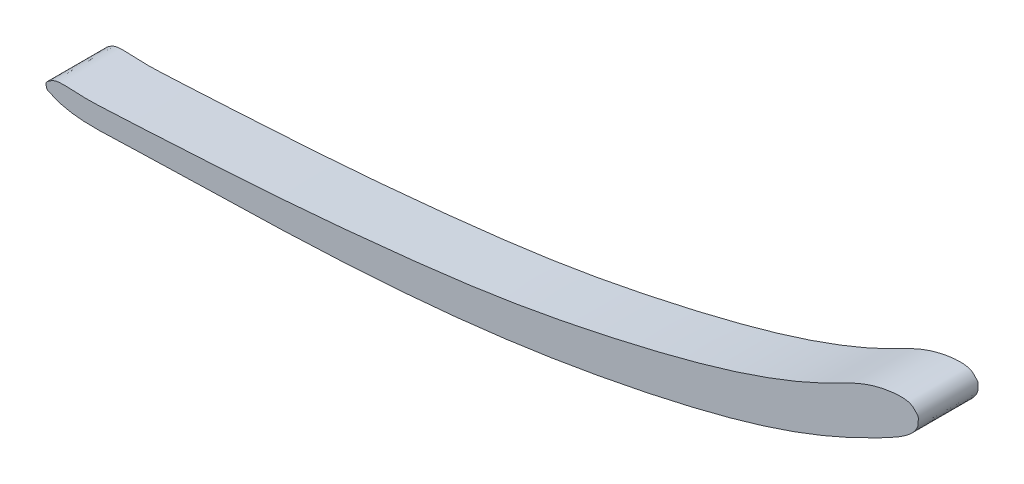
ISO-10303-21;
HEADER;
FILE_DESCRIPTION(('STEP AP214'),'2;1');
FILE_NAME('part.step','',(''),(''),'','','');
FILE_SCHEMA(('AUTOMOTIVE_DESIGN { 1 0 10303 214 1 1 1 1 }'));
ENDSEC;
DATA;
#1=APPLICATION_CONTEXT('core data for automotive mechanical design processes');
#2=APPLICATION_PROTOCOL_DEFINITION('international standard','automotive_design',2000,#1);
#3=PRODUCT_CONTEXT('',#1,'mechanical');
#4=PRODUCT('Part','Part','',(#3));
#5=PRODUCT_RELATED_PRODUCT_CATEGORY('part','',(#4));
#6=PRODUCT_DEFINITION_FORMATION('','',#4);
#7=PRODUCT_DEFINITION_CONTEXT('part definition',#1,'design');
#8=PRODUCT_DEFINITION('design','',#6,#7);
#9=PRODUCT_DEFINITION_SHAPE('','',#8);
#10=(LENGTH_UNIT() NAMED_UNIT(*) SI_UNIT(.MILLI.,.METRE.));
#11=(NAMED_UNIT(*) PLANE_ANGLE_UNIT() SI_UNIT($,.RADIAN.));
#12=(NAMED_UNIT(*) SI_UNIT($,.STERADIAN.) SOLID_ANGLE_UNIT());
#13=UNCERTAINTY_MEASURE_WITH_UNIT(LENGTH_MEASURE(1.E-05),#10,'distance_accuracy_value','');
#14=(GEOMETRIC_REPRESENTATION_CONTEXT(3) GLOBAL_UNCERTAINTY_ASSIGNED_CONTEXT((#13)) GLOBAL_UNIT_ASSIGNED_CONTEXT((#10,
#11,#12)) REPRESENTATION_CONTEXT('',''));
#15=CARTESIAN_POINT('',(0.,0.,0.));
#16=DIRECTION('',(0.,0.,1.));
#17=DIRECTION('',(1.,0.,0.));
#18=AXIS2_PLACEMENT_3D('',#15,#16,#17);
#19=CARTESIAN_POINT('',(61.9144333232568,0.,404.));
#20=CARTESIAN_POINT('',(61.8910860528611,0.0782803069081239,404.));
#21=CARTESIAN_POINT('',(61.8408245143477,0.142426428314579,404.));
#22=CARTESIAN_POINT('',(61.7354731441166,0.26430650552503,404.));
#23=CARTESIAN_POINT('',(61.6792254235422,0.321933614211289,404.));
#24=CARTESIAN_POINT('',(61.5141432967044,0.498210413844152,404.));
#25=CARTESIAN_POINT('',(61.4044094119887,0.617448967435513,404.));
#26=CARTESIAN_POINT('',(61.2223765037881,0.773551720380655,404.));
#27=CARTESIAN_POINT('',(61.1592082730367,0.822067081242661,404.));
#28=CARTESIAN_POINT('',(61.0241203339543,0.906733090161316,404.));
#29=CARTESIAN_POINT('',(60.952079215326,0.943441973781683,404.));
#30=CARTESIAN_POINT('',(60.7278566002738,1.0373110395038,404.));
#31=CARTESIAN_POINT('',(60.5728461930414,1.07679469058389,404.));
#32=CARTESIAN_POINT('',(60.2575105027948,1.13355935605872,404.));
#33=CARTESIAN_POINT('',(60.0964867874269,1.15015699680748,404.));
#34=CARTESIAN_POINT('',(59.7768234667799,1.17106697425273,404.));
#35=CARTESIAN_POINT('',(59.6174004859162,1.17499202301455,404.));
#36=CARTESIAN_POINT('',(59.1402080942976,1.16956588098227,404.));
#37=CARTESIAN_POINT('',(58.8234153505883,1.14460936181396,404.));
#38=CARTESIAN_POINT('',(57.8749129018753,1.03976827954361,404.));
#39=CARTESIAN_POINT('',(57.2432232594518,0.923753414046019,404.));
#40=CARTESIAN_POINT('',(56.0119590497997,0.6252114648298,404.));
#41=CARTESIAN_POINT('',(55.4096132540023,0.439743914805557,404.));
#42=CARTESIAN_POINT('',(53.6398182131852,-0.21811997657889,404.));
#43=CARTESIAN_POINT('',(52.5060924504743,-0.782728778117275,404.));
#44=CARTESIAN_POINT('',(50.8106571856886,-1.64256789716019,404.));
#45=CARTESIAN_POINT('',(50.245892022095,-1.93009433513777,404.));
#46=CARTESIAN_POINT('',(49.1107959664962,-2.49176632989498,404.));
#47=CARTESIAN_POINT('',(48.540878607665,-2.76690608507307,404.));
#48=CARTESIAN_POINT('',(46.8186513648411,-3.5623331004927,404.));
#49=CARTESIAN_POINT('',(45.6545778597723,-4.05433877664779,404.));
#50=CARTESIAN_POINT('',(43.3049128314598,-4.98661744932979,404.));
#51=CARTESIAN_POINT('',(42.1194629161964,-5.42723089357944,404.));
#52=CARTESIAN_POINT('',(39.7333118869133,-6.2717915160318,404.));
#53=CARTESIAN_POINT('',(38.5312212914228,-6.67432728752171,404.));
#54=CARTESIAN_POINT('',(36.1146868677063,-7.43791922463799,404.));
#55=CARTESIAN_POINT('',(34.9005206209736,-7.79988934834153,404.));
#56=CARTESIAN_POINT('',(31.2447559669853,-8.84121480780786,404.));
#57=CARTESIAN_POINT('',(28.7908168943178,-9.47699811994715,404.));
#58=CARTESIAN_POINT('',(23.8678814910705,-10.6762746103248,404.));
#59=CARTESIAN_POINT('',(21.3973067111557,-11.2376727910007,404.));
#60=CARTESIAN_POINT('',(16.4410137405621,-12.2968828971296,404.));
#61=CARTESIAN_POINT('',(13.9560203158382,-12.7949808662417,404.));
#62=CARTESIAN_POINT('',(8.96970380348965,-13.7045791162797,404.));
#63=CARTESIAN_POINT('',(6.46929570022869,-14.113864560495,404.));
#64=CARTESIAN_POINT('',(1.45584706059178,-14.8424528592261,404.));
#65=CARTESIAN_POINT('',(-1.05727965600683,-15.1638823977906,404.));
#66=CARTESIAN_POINT('',(-6.0907860040099,-15.7537126800032,404.));
#67=CARTESIAN_POINT('',(-8.61007146475508,-16.0240026915328,404.));
#68=CARTESIAN_POINT('',(-13.6519017686511,-16.5328869699139,404.));
#69=CARTESIAN_POINT('',(-16.1748387861037,-16.7691559296884,404.));
#70=CARTESIAN_POINT('',(-21.2240356467103,-17.2022823320139,404.));
#71=CARTESIAN_POINT('',(-23.750321005471,-17.3959429412104,404.));
#72=CARTESIAN_POINT('',(-28.8056607229678,-17.7456708186929,404.));
#73=CARTESIAN_POINT('',(-31.3347329163261,-17.9021657242696,404.));
#74=CARTESIAN_POINT('',(-36.3939841237608,-18.1960801375099,404.));
#75=CARTESIAN_POINT('',(-38.9239743524538,-18.3367879212014,404.));
#76=CARTESIAN_POINT('',(-42.7192454385247,-18.5424412358082,404.));
#77=CARTESIAN_POINT('',(-43.9844322281485,-18.609180636949,404.));
#78=CARTESIAN_POINT('',(-45.8825792202369,-18.7020853485504,404.));
#79=CARTESIAN_POINT('',(-46.5152644099059,-18.7339548529972,404.));
#80=CARTESIAN_POINT('',(-47.7808926174602,-18.7907697331514,404.));
#81=CARTESIAN_POINT('',(-48.4138288777348,-18.8159335272698,404.));
#82=CARTESIAN_POINT('',(-49.681050142534,-18.8304476391324,404.));
#83=CARTESIAN_POINT('',(-50.3145483583281,-18.8207531515915,404.));
#84=CARTESIAN_POINT('',(-51.5798816969746,-18.7557130850079,404.));
#85=CARTESIAN_POINT('',(-52.2133032088857,-18.69612581659,404.));
#86=CARTESIAN_POINT('',(-53.1625248065586,-18.7406766642071,404.));
#87=CARTESIAN_POINT('',(-53.4752290704572,-18.7781903810338,404.));
#88=CARTESIAN_POINT('',(-54.0785062857688,-18.9886702334022,404.));
#89=CARTESIAN_POINT('',(-54.3416471032879,-19.1636526552211,404.));
#90=CARTESIAN_POINT('',(-54.6582719989322,-19.3990568783967,404.));
#91=CARTESIAN_POINT('',(-54.7243616076951,-19.4444008530023,404.));
#92=CARTESIAN_POINT('',(-54.8320822546143,-19.5590772638887,404.));
#93=CARTESIAN_POINT('',(-54.868775297821,-19.632002493317,404.));
#94=CARTESIAN_POINT('',(-54.9003104213402,-19.7878467954328,404.));
#95=CARTESIAN_POINT('',(-54.8932597130813,-19.8674460640604,404.));
#96=CARTESIAN_POINT('',(-54.8702928024479,-20.0240472261276,404.));
#97=CARTESIAN_POINT('',(-54.8576483700863,-20.1020907287608,404.));
#98=CARTESIAN_POINT('',(-54.8129159680239,-20.2538722970682,404.));
#99=CARTESIAN_POINT('',(-54.7795147024771,-20.3285136807117,404.));
#100=CARTESIAN_POINT('',(-54.668260885,-20.4435592043035,404.));
#101=CARTESIAN_POINT('',(-54.5956987768541,-20.4788500401971,404.));
#102=CARTESIAN_POINT('',(-54.4484626961795,-20.5389778943337,404.));
#103=CARTESIAN_POINT('',(-54.3732563220533,-20.5652147871046,404.));
#104=CARTESIAN_POINT('',(-54.2257800390267,-20.6247638821378,404.));
#105=CARTESIAN_POINT('',(-54.152776918156,-20.6563094359935,404.));
#106=CARTESIAN_POINT('',(-53.9345565557629,-20.7528471657863,404.));
#107=CARTESIAN_POINT('',(-53.7901838400311,-20.8205523662182,404.));
#108=CARTESIAN_POINT('',(-53.4984217240588,-20.9463421871895,404.));
#109=CARTESIAN_POINT('',(-53.3506598366342,-21.0030716954071,404.));
#110=CARTESIAN_POINT('',(-52.9015289244283,-21.1540993560008,404.));
#111=CARTESIAN_POINT('',(-52.5952106177205,-21.2321736480998,404.));
#112=CARTESIAN_POINT('',(-51.9756954694793,-21.3657742365322,404.));
#113=CARTESIAN_POINT('',(-51.6617117145111,-21.4217538309383,404.));
#114=CARTESIAN_POINT('',(-51.0345611657516,-21.5128219054427,404.));
#115=CARTESIAN_POINT('',(-50.7208441598511,-21.5479752676143,404.));
#116=CARTESIAN_POINT('',(-49.7793324304827,-21.6270161737403,404.));
#117=CARTESIAN_POINT('',(-49.1511850565711,-21.6450749560085,404.));
#118=CARTESIAN_POINT('',(-47.8944971006351,-21.6523932411926,404.));
#119=CARTESIAN_POINT('',(-47.2659530283596,-21.6413971117434,404.));
#120=CARTESIAN_POINT('',(-45.3800645974265,-21.5896431349438,404.));
#121=CARTESIAN_POINT('',(-44.1225657541569,-21.5348316590438,404.));
#122=CARTESIAN_POINT('',(-41.6075770486901,-21.4385390885189,404.));
#123=CARTESIAN_POINT('',(-40.3499422388915,-21.3948704513751,404.));
#124=CARTESIAN_POINT('',(-36.5764686011246,-21.282010403883,404.));
#125=CARTESIAN_POINT('',(-34.0601905294723,-21.2268892585952,404.));
#126=CARTESIAN_POINT('',(-29.0279326893119,-21.1071989403538,404.));
#127=CARTESIAN_POINT('',(-26.5119344132417,-21.0429496903462,404.));
#128=CARTESIAN_POINT('',(-18.9656806214613,-20.7915105187116,404.));
#129=CARTESIAN_POINT('',(-13.9370884578859,-20.5476122800582,404.));
#130=CARTESIAN_POINT('',(-3.89806473402853,-19.8149682962137,404.));
#131=CARTESIAN_POINT('',(1.11457116242247,-19.3302947349707,404.));
#132=CARTESIAN_POINT('',(11.0964566662257,-18.0469418691553,404.));
#133=CARTESIAN_POINT('',(16.0695129384707,-17.2476191211638,404.));
#134=CARTESIAN_POINT('',(23.4874916215641,-15.8328293917239,404.));
#135=CARTESIAN_POINT('',(25.9518194938463,-15.3244007700768,404.));
#136=CARTESIAN_POINT('',(30.8628924621874,-14.2298150340925,404.));
#137=CARTESIAN_POINT('',(33.3094788452577,-13.642956294413,404.));
#138=CARTESIAN_POINT('',(38.1759464769594,-12.3511829505723,404.));
#139=CARTESIAN_POINT('',(40.5932480558674,-11.6475432563135,404.));
#140=CARTESIAN_POINT('',(45.3709187585321,-10.0635535614529,404.));
#141=CARTESIAN_POINT('',(47.7320429809903,-9.1822120566129,404.));
#142=CARTESIAN_POINT('',(52.3678797598866,-7.21627277280312,404.));
#143=CARTESIAN_POINT('',(54.6436633090672,-6.13250273778101,404.));
#144=CARTESIAN_POINT('',(57.4383790215061,-4.68342453085333,404.));
#145=CARTESIAN_POINT('',(57.9950546544809,-4.38884328687261,404.));
#146=CARTESIAN_POINT('',(58.8194171979385,-3.92829905988978,404.));
#147=CARTESIAN_POINT('',(59.0921102438671,-3.77107338908922,404.));
#148=CARTESIAN_POINT('',(59.6301895783498,-3.44367611240079,404.));
#149=CARTESIAN_POINT('',(59.8954522246401,-3.27448268456759,404.));
#150=CARTESIAN_POINT('',(60.4081515062827,-2.91293583518504,404.));
#151=CARTESIAN_POINT('',(60.6557559428328,-2.72057504134926,404.));
#152=CARTESIAN_POINT('',(61.1205080223412,-2.29549829451148,404.));
#153=CARTESIAN_POINT('',(61.3362315174206,-2.0611224534513,404.));
#154=CARTESIAN_POINT('',(61.6097391054491,-1.67636039629623,404.));
#155=CARTESIAN_POINT('',(61.6939085722394,-1.5410268633532,404.));
#156=CARTESIAN_POINT('',(61.831607027581,-1.25586574193046,404.));
#157=CARTESIAN_POINT('',(61.8856434330099,-1.10717593495038,404.));
#158=CARTESIAN_POINT('',(61.9360786227436,-0.791499600027529,404.));
#159=CARTESIAN_POINT('',(61.9300123616911,-0.632750144288069,404.));
#160=CARTESIAN_POINT('',(61.9250487639768,-0.394746434973281,404.));
#161=CARTESIAN_POINT('',(61.926934267888,-0.315510936949259,404.));
#162=CARTESIAN_POINT('',(61.9320289098032,-0.157095336859342,404.));
#163=CARTESIAN_POINT('',(61.9377805936526,-0.0782803069081239,404.));
#164=CARTESIAN_POINT('',(61.9144333232568,0.,404.));
#165=B_SPLINE_CURVE_WITH_KNOTS('',3,(#19,#20,#21,#22,#23,#24,#25,#26,#27,#28,#29,#30,#31,#32,
#33,#34,#35,#36,#37,#38,#39,#40,#41,#42,#43,#44,#45,#46,#47,#48,#49,#50,#51,#52,#53,#54,#55,#56,
#57,#58,#59,#60,#61,#62,#63,#64,#65,#66,#67,#68,#69,#70,#71,#72,#73,#74,#75,#76,#77,#78,#79,#80,
#81,#82,#83,#84,#85,#86,#87,#88,#89,#90,#91,#92,#93,#94,#95,#96,#97,#98,#99,#100,#101,#102,#103,
#104,#105,#106,#107,#108,#109,#110,#111,#112,#113,#114,#115,#116,#117,#118,#119,#120,#121,#122,
#123,#124,#125,#126,#127,#128,#129,#130,#131,#132,#133,#134,#135,#136,#137,#138,#139,#140,#141,
#142,#143,#144,#145,#146,#147,#148,#149,#150,#151,#152,#153,#154,#155,#156,#157,#158,#159,#160,
#161,#162,#163,#164),.UNSPECIFIED.,.T.,.F.,(4,2,2,2,2,2,2,2,2,2,2,2,2,2,2,2,2,2,2,2,2,2,2,2,2,2,
2,2,2,2,2,2,2,2,2,2,2,2,2,2,2,2,2,2,2,2,2,2,2,2,2,2,2,2,2,2,2,2,2,2,2,2,2,2,2,2,2,2,2,2,2,2,4),
(0.,0.00097656250000005,0.0019531250000001,0.00390625000000014,0.00488281250000016,
0.00585937500000019,0.00781250000000023,0.00976562500000027,0.0117187500000003,
0.0156250000000003,0.0234375000000003,0.0312500000000003,0.0468750000000003,0.0546875000000003,
0.0625000000000003,0.0781250000000003,0.0937500000000002,0.109375,0.125,0.15625,0.1875,0.21875,
0.25,0.28125,0.3125,0.34375,0.375,0.40625,0.4375,0.453125,0.4609375,0.46875,0.4765625,0.484375,
0.48828125,0.4921875,0.4931640625,0.494140625,0.4951171875,0.49609375,0.4970703125,0.498046875,
0.4990234375,0.5,0.501953125,0.50390625,0.5078125,0.51171875,0.515625,0.5234375,0.53125,
0.546875,0.5625,0.59375,0.625,0.6875,0.75,0.8125,0.84375,0.875,0.90625,0.9375,0.96875,0.9765625,
0.98046875,0.984375,0.98828125,0.9921875,0.994140625,0.99609375,0.998046875,0.9990234375,1.),.UNSPECIFIED.);
#166=DIRECTION('',(0.,0.,-1.));
#167=VECTOR('',#166,1.);
#168=SURFACE_OF_LINEAR_EXTRUSION('',#165,#167);
#169=CARTESIAN_POINT('',(61.9144333232568,0.,404.));
#170=CARTESIAN_POINT('',(61.9377805936526,-0.0782803069081239,404.));
#171=CARTESIAN_POINT('',(61.9320289098032,-0.157095336859342,404.));
#172=CARTESIAN_POINT('',(61.926934267888,-0.315510936949259,404.));
#173=CARTESIAN_POINT('',(61.9250487639768,-0.394746434973281,404.));
#174=CARTESIAN_POINT('',(61.9300123616911,-0.632750144288069,404.));
#175=CARTESIAN_POINT('',(61.9360786227436,-0.791499600027529,404.));
#176=CARTESIAN_POINT('',(61.8856434330099,-1.10717593495038,404.));
#177=CARTESIAN_POINT('',(61.831607027581,-1.25586574193046,404.));
#178=CARTESIAN_POINT('',(61.6939085722394,-1.5410268633532,404.));
#179=CARTESIAN_POINT('',(61.6097391054491,-1.67636039629623,404.));
#180=CARTESIAN_POINT('',(61.3362315174206,-2.0611224534513,404.));
#181=CARTESIAN_POINT('',(61.1205080223412,-2.29549829451148,404.));
#182=CARTESIAN_POINT('',(60.6557559428328,-2.72057504134926,404.));
#183=CARTESIAN_POINT('',(60.4081515062827,-2.91293583518504,404.));
#184=CARTESIAN_POINT('',(59.8954522246401,-3.27448268456759,404.));
#185=CARTESIAN_POINT('',(59.6301895783498,-3.44367611240079,404.));
#186=CARTESIAN_POINT('',(59.0921102438671,-3.77107338908922,404.));
#187=CARTESIAN_POINT('',(58.8194171979385,-3.92829905988978,404.));
#188=CARTESIAN_POINT('',(57.9950546544809,-4.38884328687261,404.));
#189=CARTESIAN_POINT('',(57.4383790215061,-4.68342453085333,404.));
#190=CARTESIAN_POINT('',(54.6436633090672,-6.13250273778101,404.));
#191=CARTESIAN_POINT('',(52.3678797598866,-7.21627277280312,404.));
#192=CARTESIAN_POINT('',(47.7320429809903,-9.1822120566129,404.));
#193=CARTESIAN_POINT('',(45.3709187585321,-10.0635535614529,404.));
#194=CARTESIAN_POINT('',(40.5932480558674,-11.6475432563135,404.));
#195=CARTESIAN_POINT('',(38.1759464769594,-12.3511829505723,404.));
#196=CARTESIAN_POINT('',(33.3094788452577,-13.642956294413,404.));
#197=CARTESIAN_POINT('',(30.8628924621874,-14.2298150340925,404.));
#198=CARTESIAN_POINT('',(25.9518194938463,-15.3244007700768,404.));
#199=CARTESIAN_POINT('',(23.4874916215641,-15.8328293917239,404.));
#200=CARTESIAN_POINT('',(16.0695129384707,-17.2476191211638,404.));
#201=CARTESIAN_POINT('',(11.0964566662257,-18.0469418691553,404.));
#202=CARTESIAN_POINT('',(1.11457116242247,-19.3302947349707,404.));
#203=CARTESIAN_POINT('',(-3.89806473402853,-19.8149682962137,404.));
#204=CARTESIAN_POINT('',(-13.9370884578859,-20.5476122800582,404.));
#205=CARTESIAN_POINT('',(-18.9656806214613,-20.7915105187116,404.));
#206=CARTESIAN_POINT('',(-26.5119344132417,-21.0429496903462,404.));
#207=CARTESIAN_POINT('',(-29.0279326893119,-21.1071989403538,404.));
#208=CARTESIAN_POINT('',(-34.0601905294723,-21.2268892585952,404.));
#209=CARTESIAN_POINT('',(-36.5764686011246,-21.282010403883,404.));
#210=CARTESIAN_POINT('',(-40.3499422388915,-21.3948704513751,404.));
#211=CARTESIAN_POINT('',(-41.6075770486901,-21.4385390885189,404.));
#212=CARTESIAN_POINT('',(-44.1225657541569,-21.5348316590438,404.));
#213=CARTESIAN_POINT('',(-45.3800645974265,-21.5896431349438,404.));
#214=CARTESIAN_POINT('',(-47.2659530283596,-21.6413971117434,404.));
#215=CARTESIAN_POINT('',(-47.8944971006351,-21.6523932411926,404.));
#216=CARTESIAN_POINT('',(-49.1511850565711,-21.6450749560085,404.));
#217=CARTESIAN_POINT('',(-49.7793324304827,-21.6270161737403,404.));
#218=CARTESIAN_POINT('',(-50.7208441598511,-21.5479752676143,404.));
#219=CARTESIAN_POINT('',(-51.0345611657516,-21.5128219054427,404.));
#220=CARTESIAN_POINT('',(-51.6617117145111,-21.4217538309383,404.));
#221=CARTESIAN_POINT('',(-51.9756954694793,-21.3657742365322,404.));
#222=CARTESIAN_POINT('',(-52.5952106177205,-21.2321736480998,404.));
#223=CARTESIAN_POINT('',(-52.9015289244283,-21.1540993560008,404.));
#224=CARTESIAN_POINT('',(-53.3506598366342,-21.0030716954071,404.));
#225=CARTESIAN_POINT('',(-53.4984217240588,-20.9463421871895,404.));
#226=CARTESIAN_POINT('',(-53.7901838400311,-20.8205523662182,404.));
#227=CARTESIAN_POINT('',(-53.9345565557629,-20.7528471657863,404.));
#228=CARTESIAN_POINT('',(-54.152776918156,-20.6563094359935,404.));
#229=CARTESIAN_POINT('',(-54.2257800390267,-20.6247638821378,404.));
#230=CARTESIAN_POINT('',(-54.3732563220533,-20.5652147871046,404.));
#231=CARTESIAN_POINT('',(-54.4484626961795,-20.5389778943337,404.));
#232=CARTESIAN_POINT('',(-54.5956987768541,-20.4788500401971,404.));
#233=CARTESIAN_POINT('',(-54.668260885,-20.4435592043035,404.));
#234=CARTESIAN_POINT('',(-54.7795147024771,-20.3285136807117,404.));
#235=CARTESIAN_POINT('',(-54.8129159680239,-20.2538722970682,404.));
#236=CARTESIAN_POINT('',(-54.8576483700863,-20.1020907287608,404.));
#237=CARTESIAN_POINT('',(-54.8702928024479,-20.0240472261276,404.));
#238=CARTESIAN_POINT('',(-54.8932597130813,-19.8674460640604,404.));
#239=CARTESIAN_POINT('',(-54.9003104213402,-19.7878467954328,404.));
#240=CARTESIAN_POINT('',(-54.868775297821,-19.632002493317,404.));
#241=CARTESIAN_POINT('',(-54.8320822546143,-19.5590772638887,404.));
#242=CARTESIAN_POINT('',(-54.7243616076951,-19.4444008530023,404.));
#243=CARTESIAN_POINT('',(-54.6582719989322,-19.3990568783967,404.));
#244=CARTESIAN_POINT('',(-54.3416471032879,-19.1636526552211,404.));
#245=CARTESIAN_POINT('',(-54.0785062857688,-18.9886702334022,404.));
#246=CARTESIAN_POINT('',(-53.4752290704572,-18.7781903810338,404.));
#247=CARTESIAN_POINT('',(-53.1625248065586,-18.7406766642071,404.));
#248=CARTESIAN_POINT('',(-52.2133032088857,-18.69612581659,404.));
#249=CARTESIAN_POINT('',(-51.5798816969746,-18.7557130850079,404.));
#250=CARTESIAN_POINT('',(-50.3145483583281,-18.8207531515915,404.));
#251=CARTESIAN_POINT('',(-49.681050142534,-18.8304476391324,404.));
#252=CARTESIAN_POINT('',(-48.4138288777348,-18.8159335272698,404.));
#253=CARTESIAN_POINT('',(-47.7808926174602,-18.7907697331514,404.));
#254=CARTESIAN_POINT('',(-46.5152644099059,-18.7339548529972,404.));
#255=CARTESIAN_POINT('',(-45.8825792202369,-18.7020853485504,404.));
#256=CARTESIAN_POINT('',(-43.9844322281485,-18.609180636949,404.));
#257=CARTESIAN_POINT('',(-42.7192454385247,-18.5424412358082,404.));
#258=CARTESIAN_POINT('',(-38.9239743524538,-18.3367879212014,404.));
#259=CARTESIAN_POINT('',(-36.3939841237608,-18.1960801375099,404.));
#260=CARTESIAN_POINT('',(-31.3347329163261,-17.9021657242696,404.));
#261=CARTESIAN_POINT('',(-28.8056607229678,-17.7456708186929,404.));
#262=CARTESIAN_POINT('',(-23.750321005471,-17.3959429412104,404.));
#263=CARTESIAN_POINT('',(-21.2240356467103,-17.2022823320139,404.));
#264=CARTESIAN_POINT('',(-16.1748387861037,-16.7691559296884,404.));
#265=CARTESIAN_POINT('',(-13.6519017686511,-16.5328869699139,404.));
#266=CARTESIAN_POINT('',(-8.61007146475508,-16.0240026915328,404.));
#267=CARTESIAN_POINT('',(-6.0907860040099,-15.7537126800032,404.));
#268=CARTESIAN_POINT('',(-1.05727965600683,-15.1638823977906,404.));
#269=CARTESIAN_POINT('',(1.45584706059178,-14.8424528592261,404.));
#270=CARTESIAN_POINT('',(6.46929570022869,-14.113864560495,404.));
#271=CARTESIAN_POINT('',(8.96970380348965,-13.7045791162797,404.));
#272=CARTESIAN_POINT('',(13.9560203158382,-12.7949808662417,404.));
#273=CARTESIAN_POINT('',(16.4410137405621,-12.2968828971296,404.));
#274=CARTESIAN_POINT('',(21.3973067111557,-11.2376727910007,404.));
#275=CARTESIAN_POINT('',(23.8678814910705,-10.6762746103248,404.));
#276=CARTESIAN_POINT('',(28.7908168943178,-9.47699811994715,404.));
#277=CARTESIAN_POINT('',(31.2447559669853,-8.84121480780786,404.));
#278=CARTESIAN_POINT('',(34.9005206209736,-7.79988934834153,404.));
#279=CARTESIAN_POINT('',(36.1146868677063,-7.43791922463799,404.));
#280=CARTESIAN_POINT('',(38.5312212914228,-6.67432728752171,404.));
#281=CARTESIAN_POINT('',(39.7333118869133,-6.2717915160318,404.));
#282=CARTESIAN_POINT('',(42.1194629161964,-5.42723089357944,404.));
#283=CARTESIAN_POINT('',(43.3049128314598,-4.98661744932979,404.));
#284=CARTESIAN_POINT('',(45.6545778597723,-4.05433877664779,404.));
#285=CARTESIAN_POINT('',(46.8186513648411,-3.5623331004927,404.));
#286=CARTESIAN_POINT('',(48.540878607665,-2.76690608507307,404.));
#287=CARTESIAN_POINT('',(49.1107959664962,-2.49176632989498,404.));
#288=CARTESIAN_POINT('',(50.245892022095,-1.93009433513777,404.));
#289=CARTESIAN_POINT('',(50.8106571856886,-1.64256789716019,404.));
#290=CARTESIAN_POINT('',(52.5060924504743,-0.782728778117275,404.));
#291=CARTESIAN_POINT('',(53.6398182131852,-0.21811997657889,404.));
#292=CARTESIAN_POINT('',(55.4096132540023,0.439743914805557,404.));
#293=CARTESIAN_POINT('',(56.0119590497997,0.6252114648298,404.));
#294=CARTESIAN_POINT('',(57.2432232594518,0.923753414046019,404.));
#295=CARTESIAN_POINT('',(57.8749129018753,1.03976827954361,404.));
#296=CARTESIAN_POINT('',(58.8234153505883,1.14460936181396,404.));
#297=CARTESIAN_POINT('',(59.1402080942976,1.16956588098227,404.));
#298=CARTESIAN_POINT('',(59.6174004859162,1.17499202301455,404.));
#299=CARTESIAN_POINT('',(59.7768234667799,1.17106697425273,404.));
#300=CARTESIAN_POINT('',(60.0964867874269,1.15015699680748,404.));
#301=CARTESIAN_POINT('',(60.2575105027948,1.13355935605872,404.));
#302=CARTESIAN_POINT('',(60.5728461930414,1.07679469058389,404.));
#303=CARTESIAN_POINT('',(60.7278566002738,1.0373110395038,404.));
#304=CARTESIAN_POINT('',(60.952079215326,0.943441973781683,404.));
#305=CARTESIAN_POINT('',(61.0241203339543,0.906733090161316,404.));
#306=CARTESIAN_POINT('',(61.1592082730367,0.822067081242661,404.));
#307=CARTESIAN_POINT('',(61.2223765037881,0.773551720380655,404.));
#308=CARTESIAN_POINT('',(61.4044094119887,0.617448967435513,404.));
#309=CARTESIAN_POINT('',(61.5141432967044,0.498210413844152,404.));
#310=CARTESIAN_POINT('',(61.6792254235422,0.321933614211289,404.));
#311=CARTESIAN_POINT('',(61.7354731441166,0.26430650552503,404.));
#312=CARTESIAN_POINT('',(61.8408245143477,0.142426428314579,404.));
#313=CARTESIAN_POINT('',(61.8910860528611,0.0782803069081239,404.));
#314=CARTESIAN_POINT('',(61.9144333232568,0.,404.));
#315=B_SPLINE_CURVE_WITH_KNOTS('',3,(#169,#170,#171,#172,#173,#174,#175,#176,#177,#178,#179,
#180,#181,#182,#183,#184,#185,#186,#187,#188,#189,#190,#191,#192,#193,#194,#195,#196,#197,#198,
#199,#200,#201,#202,#203,#204,#205,#206,#207,#208,#209,#210,#211,#212,#213,#214,#215,#216,#217,
#218,#219,#220,#221,#222,#223,#224,#225,#226,#227,#228,#229,#230,#231,#232,#233,#234,#235,#236,
#237,#238,#239,#240,#241,#242,#243,#244,#245,#246,#247,#248,#249,#250,#251,#252,#253,#254,#255,
#256,#257,#258,#259,#260,#261,#262,#263,#264,#265,#266,#267,#268,#269,#270,#271,#272,#273,#274,
#275,#276,#277,#278,#279,#280,#281,#282,#283,#284,#285,#286,#287,#288,#289,#290,#291,#292,#293,
#294,#295,#296,#297,#298,#299,#300,#301,#302,#303,#304,#305,#306,#307,#308,#309,#310,#311,#312,
#313,#314),.UNSPECIFIED.,.T.,.F.,(4,2,2,2,2,2,2,2,2,2,2,2,2,2,2,2,2,2,2,2,2,2,2,2,2,2,2,2,2,2,2,
2,2,2,2,2,2,2,2,2,2,2,2,2,2,2,2,2,2,2,2,2,2,2,2,2,2,2,2,2,2,2,2,2,2,2,2,2,2,2,2,2,4),(0.,
0.000976562499999889,0.001953125,0.00390625,0.005859375,0.0078125,0.0117187499999999,
0.0156249999999999,0.0195312499999999,0.0234374999999999,0.0312499999999999,0.0625,0.09375,
0.125,0.15625,0.1875,0.25,0.3125,0.375,0.40625,0.4375,0.453125,0.46875,0.4765625,0.484375,
0.48828125,0.4921875,0.49609375,0.498046875,0.5,0.5009765625,0.501953125,0.5029296875,
0.50390625,0.5048828125,0.505859375,0.5068359375,0.5078125,0.51171875,0.515625,0.5234375,
0.53125,0.5390625,0.546875,0.5625,0.59375,0.625,0.65625,0.6875,0.71875,0.75,0.78125,0.8125,
0.84375,0.875,0.890625,0.90625,0.921875,0.9375,0.9453125,0.953125,0.96875,0.9765625,0.984375,
0.98828125,0.990234375,0.9921875,0.994140625,0.9951171875,0.99609375,0.998046875,0.9990234375,
1.),.UNSPECIFIED.);
#316=CARTESIAN_POINT('',(61.9144333232568,0.,404.));
#317=VERTEX_POINT('',#316);
#318=EDGE_CURVE('E10',#317,#317,#315,.F.);
#319=ORIENTED_EDGE('',*,*,#318,.F.);
#320=EDGE_LOOP('',(#319));
#321=FACE_BOUND('',#320,.T.);
#322=CARTESIAN_POINT('',(61.9144333232568,0.,396.000000000001));
#323=CARTESIAN_POINT('',(61.8910860528611,0.0782803069081239,396.000000000001));
#324=CARTESIAN_POINT('',(61.8408245143477,0.142426428314579,396.000000000001));
#325=CARTESIAN_POINT('',(61.7354731441166,0.26430650552503,396.000000000001));
#326=CARTESIAN_POINT('',(61.6792254235422,0.321933614211289,396.000000000001));
#327=CARTESIAN_POINT('',(61.5141432967044,0.498210413844152,396.000000000001));
#328=CARTESIAN_POINT('',(61.4044094119887,0.617448967435513,396.000000000001));
#329=CARTESIAN_POINT('',(61.2223765037881,0.773551720380655,396.000000000001));
#330=CARTESIAN_POINT('',(61.1592082730367,0.822067081242661,396.000000000001));
#331=CARTESIAN_POINT('',(61.0241203339543,0.906733090161316,396.000000000001));
#332=CARTESIAN_POINT('',(60.952079215326,0.943441973781683,396.000000000001));
#333=CARTESIAN_POINT('',(60.7278566002738,1.0373110395038,396.000000000001));
#334=CARTESIAN_POINT('',(60.5728461930414,1.07679469058389,396.000000000001));
#335=CARTESIAN_POINT('',(60.2575105027948,1.13355935605872,396.000000000001));
#336=CARTESIAN_POINT('',(60.0964867874269,1.15015699680748,396.000000000001));
#337=CARTESIAN_POINT('',(59.7768234667799,1.17106697425273,396.000000000001));
#338=CARTESIAN_POINT('',(59.6174004859162,1.17499202301455,396.000000000001));
#339=CARTESIAN_POINT('',(59.1402080942976,1.16956588098227,396.000000000001));
#340=CARTESIAN_POINT('',(58.8234153505883,1.14460936181396,396.000000000001));
#341=CARTESIAN_POINT('',(57.8749129018753,1.03976827954361,396.000000000001));
#342=CARTESIAN_POINT('',(57.2432232594518,0.923753414046019,396.000000000001));
#343=CARTESIAN_POINT('',(56.0119590497997,0.6252114648298,396.000000000001));
#344=CARTESIAN_POINT('',(55.4096132540023,0.439743914805557,396.000000000001));
#345=CARTESIAN_POINT('',(53.6398182131852,-0.21811997657889,396.000000000001));
#346=CARTESIAN_POINT('',(52.5060924504743,-0.782728778117275,396.000000000001));
#347=CARTESIAN_POINT('',(50.8106571856886,-1.64256789716019,396.000000000001));
#348=CARTESIAN_POINT('',(50.245892022095,-1.93009433513777,396.000000000001));
#349=CARTESIAN_POINT('',(49.1107959664962,-2.49176632989498,396.000000000001));
#350=CARTESIAN_POINT('',(48.540878607665,-2.76690608507307,396.000000000001));
#351=CARTESIAN_POINT('',(46.8186513648411,-3.5623331004927,396.000000000001));
#352=CARTESIAN_POINT('',(45.6545778597723,-4.05433877664779,396.000000000001));
#353=CARTESIAN_POINT('',(43.3049128314598,-4.98661744932979,396.000000000001));
#354=CARTESIAN_POINT('',(42.1194629161964,-5.42723089357944,396.000000000001));
#355=CARTESIAN_POINT('',(39.7333118869133,-6.2717915160318,396.000000000001));
#356=CARTESIAN_POINT('',(38.5312212914228,-6.67432728752171,396.000000000001));
#357=CARTESIAN_POINT('',(36.1146868677063,-7.43791922463799,396.000000000001));
#358=CARTESIAN_POINT('',(34.9005206209736,-7.79988934834153,396.000000000001));
#359=CARTESIAN_POINT('',(31.2447559669853,-8.84121480780786,396.000000000001));
#360=CARTESIAN_POINT('',(28.7908168943178,-9.47699811994715,396.000000000001));
#361=CARTESIAN_POINT('',(23.8678814910705,-10.6762746103248,396.000000000001));
#362=CARTESIAN_POINT('',(21.3973067111557,-11.2376727910007,396.000000000001));
#363=CARTESIAN_POINT('',(16.4410137405621,-12.2968828971296,396.000000000001));
#364=CARTESIAN_POINT('',(13.9560203158382,-12.7949808662417,396.000000000001));
#365=CARTESIAN_POINT('',(8.96970380348965,-13.7045791162797,396.000000000001));
#366=CARTESIAN_POINT('',(6.46929570022869,-14.113864560495,396.000000000001));
#367=CARTESIAN_POINT('',(1.45584706059178,-14.8424528592261,396.000000000001));
#368=CARTESIAN_POINT('',(-1.05727965600683,-15.1638823977906,396.000000000001));
#369=CARTESIAN_POINT('',(-6.0907860040099,-15.7537126800032,396.000000000001));
#370=CARTESIAN_POINT('',(-8.61007146475508,-16.0240026915328,396.000000000001));
#371=CARTESIAN_POINT('',(-13.6519017686511,-16.5328869699139,396.000000000001));
#372=CARTESIAN_POINT('',(-16.1748387861037,-16.7691559296884,396.000000000001));
#373=CARTESIAN_POINT('',(-21.2240356467103,-17.2022823320139,396.000000000001));
#374=CARTESIAN_POINT('',(-23.750321005471,-17.3959429412104,396.000000000001));
#375=CARTESIAN_POINT('',(-28.8056607229678,-17.7456708186929,396.000000000001));
#376=CARTESIAN_POINT('',(-31.3347329163261,-17.9021657242696,396.000000000001));
#377=CARTESIAN_POINT('',(-36.3939841237608,-18.1960801375099,396.000000000001));
#378=CARTESIAN_POINT('',(-38.9239743524538,-18.3367879212014,396.000000000001));
#379=CARTESIAN_POINT('',(-42.7192454385247,-18.5424412358082,396.000000000001));
#380=CARTESIAN_POINT('',(-43.9844322281485,-18.609180636949,396.000000000001));
#381=CARTESIAN_POINT('',(-45.8825792202369,-18.7020853485504,396.000000000001));
#382=CARTESIAN_POINT('',(-46.5152644099059,-18.7339548529972,396.000000000001));
#383=CARTESIAN_POINT('',(-47.7808926174602,-18.7907697331514,396.000000000001));
#384=CARTESIAN_POINT('',(-48.4138288777348,-18.8159335272698,396.000000000001));
#385=CARTESIAN_POINT('',(-49.681050142534,-18.8304476391324,396.000000000001));
#386=CARTESIAN_POINT('',(-50.3145483583281,-18.8207531515915,396.000000000001));
#387=CARTESIAN_POINT('',(-51.5798816969746,-18.7557130850079,396.000000000001));
#388=CARTESIAN_POINT('',(-52.2133032088857,-18.69612581659,396.000000000001));
#389=CARTESIAN_POINT('',(-53.1625248065586,-18.7406766642071,396.000000000001));
#390=CARTESIAN_POINT('',(-53.4752290704572,-18.7781903810338,396.000000000001));
#391=CARTESIAN_POINT('',(-54.0785062857688,-18.9886702334022,396.000000000001));
#392=CARTESIAN_POINT('',(-54.3416471032879,-19.1636526552211,396.000000000001));
#393=CARTESIAN_POINT('',(-54.6582719989322,-19.3990568783967,396.000000000001));
#394=CARTESIAN_POINT('',(-54.7243616076951,-19.4444008530023,396.000000000001));
#395=CARTESIAN_POINT('',(-54.8320822546143,-19.5590772638887,396.000000000001));
#396=CARTESIAN_POINT('',(-54.868775297821,-19.632002493317,396.000000000001));
#397=CARTESIAN_POINT('',(-54.9003104213402,-19.7878467954328,396.000000000001));
#398=CARTESIAN_POINT('',(-54.8932597130813,-19.8674460640604,396.000000000001));
#399=CARTESIAN_POINT('',(-54.8702928024479,-20.0240472261276,396.000000000001));
#400=CARTESIAN_POINT('',(-54.8576483700863,-20.1020907287608,396.000000000001));
#401=CARTESIAN_POINT('',(-54.8129159680239,-20.2538722970682,396.000000000001));
#402=CARTESIAN_POINT('',(-54.7795147024771,-20.3285136807117,396.000000000001));
#403=CARTESIAN_POINT('',(-54.668260885,-20.4435592043035,396.000000000001));
#404=CARTESIAN_POINT('',(-54.5956987768541,-20.4788500401971,396.000000000001));
#405=CARTESIAN_POINT('',(-54.4484626961795,-20.5389778943337,396.000000000001));
#406=CARTESIAN_POINT('',(-54.3732563220533,-20.5652147871046,396.000000000001));
#407=CARTESIAN_POINT('',(-54.2257800390267,-20.6247638821378,396.000000000001));
#408=CARTESIAN_POINT('',(-54.152776918156,-20.6563094359935,396.000000000001));
#409=CARTESIAN_POINT('',(-53.9345565557629,-20.7528471657863,396.000000000001));
#410=CARTESIAN_POINT('',(-53.7901838400311,-20.8205523662182,396.000000000001));
#411=CARTESIAN_POINT('',(-53.4984217240588,-20.9463421871895,396.000000000001));
#412=CARTESIAN_POINT('',(-53.3506598366342,-21.0030716954071,396.000000000001));
#413=CARTESIAN_POINT('',(-52.9015289244283,-21.1540993560008,396.000000000001));
#414=CARTESIAN_POINT('',(-52.5952106177205,-21.2321736480998,396.000000000001));
#415=CARTESIAN_POINT('',(-51.9756954694793,-21.3657742365322,396.000000000001));
#416=CARTESIAN_POINT('',(-51.6617117145111,-21.4217538309383,396.000000000001));
#417=CARTESIAN_POINT('',(-51.0345611657516,-21.5128219054427,396.000000000001));
#418=CARTESIAN_POINT('',(-50.7208441598511,-21.5479752676143,396.000000000001));
#419=CARTESIAN_POINT('',(-49.7793324304827,-21.6270161737403,396.000000000001));
#420=CARTESIAN_POINT('',(-49.1511850565711,-21.6450749560085,396.000000000001));
#421=CARTESIAN_POINT('',(-47.8944971006351,-21.6523932411926,396.000000000001));
#422=CARTESIAN_POINT('',(-47.2659530283596,-21.6413971117434,396.000000000001));
#423=CARTESIAN_POINT('',(-45.3800645974265,-21.5896431349438,396.000000000001));
#424=CARTESIAN_POINT('',(-44.1225657541569,-21.5348316590438,396.000000000001));
#425=CARTESIAN_POINT('',(-41.6075770486901,-21.4385390885189,396.000000000001));
#426=CARTESIAN_POINT('',(-40.3499422388915,-21.3948704513751,396.000000000001));
#427=CARTESIAN_POINT('',(-36.5764686011246,-21.282010403883,396.000000000001));
#428=CARTESIAN_POINT('',(-34.0601905294723,-21.2268892585952,396.000000000001));
#429=CARTESIAN_POINT('',(-29.0279326893119,-21.1071989403538,396.000000000001));
#430=CARTESIAN_POINT('',(-26.5119344132417,-21.0429496903462,396.000000000001));
#431=CARTESIAN_POINT('',(-18.9656806214613,-20.7915105187116,396.000000000001));
#432=CARTESIAN_POINT('',(-13.9370884578859,-20.5476122800582,396.000000000001));
#433=CARTESIAN_POINT('',(-3.89806473402853,-19.8149682962137,396.000000000001));
#434=CARTESIAN_POINT('',(1.11457116242247,-19.3302947349707,396.000000000001));
#435=CARTESIAN_POINT('',(11.0964566662257,-18.0469418691553,396.000000000001));
#436=CARTESIAN_POINT('',(16.0695129384707,-17.2476191211638,396.000000000001));
#437=CARTESIAN_POINT('',(23.4874916215641,-15.8328293917239,396.000000000001));
#438=CARTESIAN_POINT('',(25.9518194938463,-15.3244007700768,396.000000000001));
#439=CARTESIAN_POINT('',(30.8628924621874,-14.2298150340925,396.000000000001));
#440=CARTESIAN_POINT('',(33.3094788452577,-13.642956294413,396.000000000001));
#441=CARTESIAN_POINT('',(38.1759464769594,-12.3511829505723,396.000000000001));
#442=CARTESIAN_POINT('',(40.5932480558674,-11.6475432563135,396.000000000001));
#443=CARTESIAN_POINT('',(45.3709187585321,-10.0635535614529,396.000000000001));
#444=CARTESIAN_POINT('',(47.7320429809903,-9.1822120566129,396.000000000001));
#445=CARTESIAN_POINT('',(52.3678797598866,-7.21627277280312,396.000000000001));
#446=CARTESIAN_POINT('',(54.6436633090672,-6.13250273778101,396.000000000001));
#447=CARTESIAN_POINT('',(57.4383790215061,-4.68342453085333,396.000000000001));
#448=CARTESIAN_POINT('',(57.9950546544809,-4.38884328687261,396.000000000001));
#449=CARTESIAN_POINT('',(58.8194171979385,-3.92829905988978,396.000000000001));
#450=CARTESIAN_POINT('',(59.0921102438671,-3.77107338908922,396.000000000001));
#451=CARTESIAN_POINT('',(59.6301895783498,-3.44367611240079,396.000000000001));
#452=CARTESIAN_POINT('',(59.8954522246401,-3.27448268456759,396.000000000001));
#453=CARTESIAN_POINT('',(60.4081515062827,-2.91293583518504,396.000000000001));
#454=CARTESIAN_POINT('',(60.6557559428328,-2.72057504134926,396.000000000001));
#455=CARTESIAN_POINT('',(61.1205080223412,-2.29549829451148,396.000000000001));
#456=CARTESIAN_POINT('',(61.3362315174206,-2.0611224534513,396.000000000001));
#457=CARTESIAN_POINT('',(61.6097391054491,-1.67636039629623,396.000000000001));
#458=CARTESIAN_POINT('',(61.6939085722394,-1.5410268633532,396.000000000001));
#459=CARTESIAN_POINT('',(61.831607027581,-1.25586574193046,396.000000000001));
#460=CARTESIAN_POINT('',(61.8856434330099,-1.10717593495038,396.000000000001));
#461=CARTESIAN_POINT('',(61.9360786227436,-0.791499600027529,396.000000000001));
#462=CARTESIAN_POINT('',(61.9300123616911,-0.632750144288069,396.000000000001));
#463=CARTESIAN_POINT('',(61.9250487639768,-0.394746434973281,396.000000000001));
#464=CARTESIAN_POINT('',(61.926934267888,-0.315510936949259,396.000000000001));
#465=CARTESIAN_POINT('',(61.9320289098032,-0.157095336859342,396.000000000001));
#466=CARTESIAN_POINT('',(61.9377805936526,-0.0782803069081239,396.000000000001));
#467=CARTESIAN_POINT('',(61.9144333232568,0.,396.000000000001));
#468=B_SPLINE_CURVE_WITH_KNOTS('',3,(#322,#323,#324,#325,#326,#327,#328,#329,#330,#331,#332,
#333,#334,#335,#336,#337,#338,#339,#340,#341,#342,#343,#344,#345,#346,#347,#348,#349,#350,#351,
#352,#353,#354,#355,#356,#357,#358,#359,#360,#361,#362,#363,#364,#365,#366,#367,#368,#369,#370,
#371,#372,#373,#374,#375,#376,#377,#378,#379,#380,#381,#382,#383,#384,#385,#386,#387,#388,#389,
#390,#391,#392,#393,#394,#395,#396,#397,#398,#399,#400,#401,#402,#403,#404,#405,#406,#407,#408,
#409,#410,#411,#412,#413,#414,#415,#416,#417,#418,#419,#420,#421,#422,#423,#424,#425,#426,#427,
#428,#429,#430,#431,#432,#433,#434,#435,#436,#437,#438,#439,#440,#441,#442,#443,#444,#445,#446,
#447,#448,#449,#450,#451,#452,#453,#454,#455,#456,#457,#458,#459,#460,#461,#462,#463,#464,#465,
#466,#467),.UNSPECIFIED.,.T.,.F.,(4,2,2,2,2,2,2,2,2,2,2,2,2,2,2,2,2,2,2,2,2,2,2,2,2,2,2,2,2,2,2,
2,2,2,2,2,2,2,2,2,2,2,2,2,2,2,2,2,2,2,2,2,2,2,2,2,2,2,2,2,2,2,2,2,2,2,2,2,2,2,2,2,4),(0.,
0.00097656250000005,0.0019531250000001,0.00390625000000014,0.00488281250000016,
0.00585937500000019,0.00781250000000023,0.00976562500000027,0.0117187500000003,
0.0156250000000003,0.0234375000000003,0.0312500000000003,0.0468750000000003,0.0546875000000003,
0.0625000000000003,0.0781250000000003,0.0937500000000002,0.109375,0.125,0.15625,0.1875,0.21875,
0.25,0.28125,0.3125,0.34375,0.375,0.40625,0.4375,0.453125,0.4609375,0.46875,0.4765625,0.484375,
0.48828125,0.4921875,0.4931640625,0.494140625,0.4951171875,0.49609375,0.4970703125,0.498046875,
0.4990234375,0.5,0.501953125,0.50390625,0.5078125,0.51171875,0.515625,0.5234375,0.53125,
0.546875,0.5625,0.59375,0.625,0.6875,0.75,0.8125,0.84375,0.875,0.90625,0.9375,0.96875,0.9765625,
0.98046875,0.984375,0.98828125,0.9921875,0.994140625,0.99609375,0.998046875,0.9990234375,1.),.UNSPECIFIED.);
#469=CARTESIAN_POINT('',(61.9144333232568,0.,396.000000000001));
#470=VERTEX_POINT('',#469);
#471=EDGE_CURVE('E38',#470,#470,#468,.T.);
#472=ORIENTED_EDGE('',*,*,#471,.T.);
#473=EDGE_LOOP('',(#472));
#474=FACE_BOUND('',#473,.T.);
#475=ADVANCED_FACE('F28',(#321,#474),#168,.F.);
#476=CARTESIAN_POINT('',(-54.0800367973583,-20.6884886792578,404.));
#477=DIRECTION('',(0.,0.,-1.));
#478=DIRECTION('',(-1.,0.,0.));
#479=AXIS2_PLACEMENT_3D('',#476,#477,#478);
#480=PLANE('',#479);
#481=ORIENTED_EDGE('',*,*,#318,.T.);
#482=EDGE_LOOP('',(#481));
#483=FACE_BOUND('',#482,.T.);
#484=ADVANCED_FACE('F69',(#483),#480,.F.);
#485=CARTESIAN_POINT('',(-54.0800367973583,-20.6884886792578,396.));
#486=DIRECTION('',(0.,0.,-1.));
#487=DIRECTION('',(-1.,0.,0.));
#488=AXIS2_PLACEMENT_3D('',#485,#486,#487);
#489=PLANE('',#488);
#490=ORIENTED_EDGE('',*,*,#471,.F.);
#491=EDGE_LOOP('',(#490));
#492=FACE_BOUND('',#491,.T.);
#493=ADVANCED_FACE('F77',(#492),#489,.T.);
#494=CLOSED_SHELL('',(#475,#484,#493));
#495=MANIFOLD_SOLID_BREP('B2',#494);
#496=ADVANCED_BREP_SHAPE_REPRESENTATION('',(#18,#495),#14);
#497=SHAPE_DEFINITION_REPRESENTATION(#9,#496);
ENDSEC;
END-ISO-10303-21;
